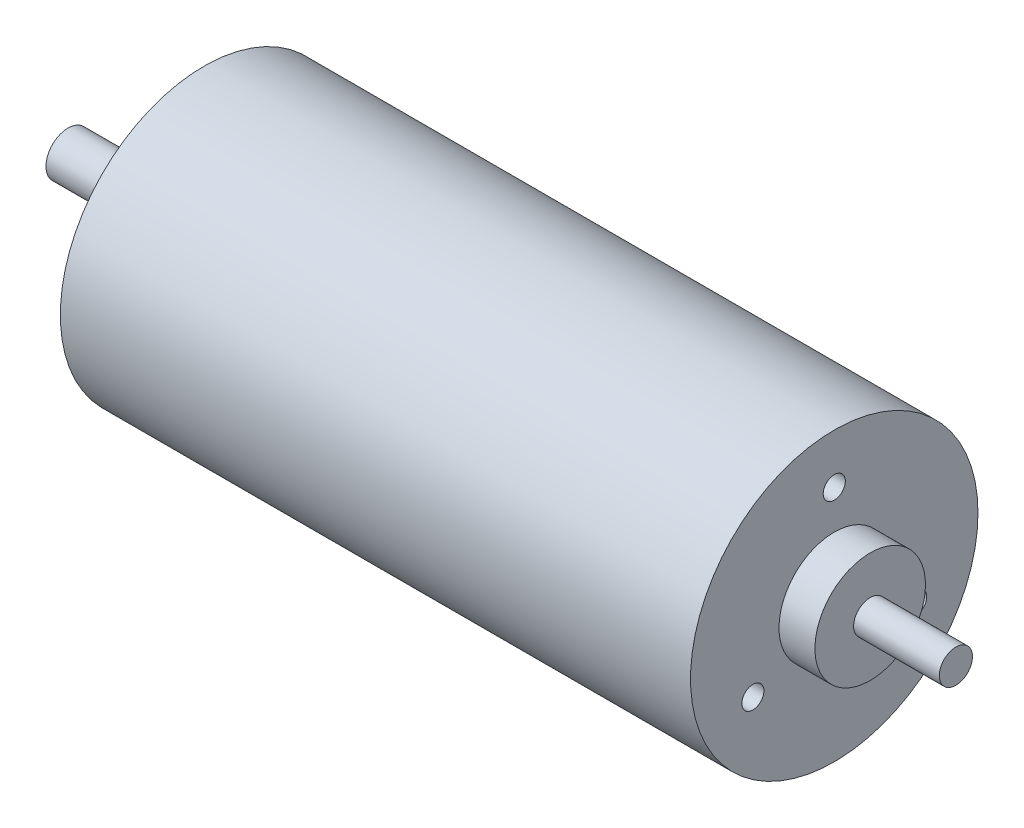
ISO-10303-21;
HEADER;
FILE_DESCRIPTION(('STEP AP214'),'2;1');
FILE_NAME('part.step','',(''),(''),'','','');
FILE_SCHEMA(('AUTOMOTIVE_DESIGN { 1 0 10303 214 1 1 1 1 }'));
ENDSEC;
DATA;
#1=APPLICATION_CONTEXT('core data for automotive mechanical design processes');
#2=APPLICATION_PROTOCOL_DEFINITION('international standard','automotive_design',2000,#1);
#3=PRODUCT_CONTEXT('',#1,'mechanical');
#4=PRODUCT('Part','Part','',(#3));
#5=PRODUCT_RELATED_PRODUCT_CATEGORY('part','',(#4));
#6=PRODUCT_DEFINITION_FORMATION('','',#4);
#7=PRODUCT_DEFINITION_CONTEXT('part definition',#1,'design');
#8=PRODUCT_DEFINITION('design','',#6,#7);
#9=PRODUCT_DEFINITION_SHAPE('','',#8);
#10=(LENGTH_UNIT() NAMED_UNIT(*) SI_UNIT(.MILLI.,.METRE.));
#11=(NAMED_UNIT(*) PLANE_ANGLE_UNIT() SI_UNIT($,.RADIAN.));
#12=(NAMED_UNIT(*) SI_UNIT($,.STERADIAN.) SOLID_ANGLE_UNIT());
#13=UNCERTAINTY_MEASURE_WITH_UNIT(LENGTH_MEASURE(1.E-05),#10,'distance_accuracy_value','');
#14=(GEOMETRIC_REPRESENTATION_CONTEXT(3) GLOBAL_UNCERTAINTY_ASSIGNED_CONTEXT((#13)) GLOBAL_UNIT_ASSIGNED_CONTEXT((#10,
#11,#12)) REPRESENTATION_CONTEXT('',''));
#15=CARTESIAN_POINT('',(0.,0.,0.));
#16=DIRECTION('',(0.,0.,1.));
#17=DIRECTION('',(1.,0.,0.));
#18=AXIS2_PLACEMENT_3D('',#15,#16,#17);
#19=CARTESIAN_POINT('',(0.,0.,0.));
#20=DIRECTION('',(-1.,0.,0.));
#21=DIRECTION('',(0.,0.,1.));
#22=AXIS2_PLACEMENT_3D('',#19,#20,#21);
#23=PLANE('',#22);
#24=CARTESIAN_POINT('',(0.,0.,0.));
#25=DIRECTION('',(1.,0.,0.));
#26=DIRECTION('',(0.,0.,-1.));
#27=AXIS2_PLACEMENT_3D('',#24,#25,#26);
#28=CIRCLE('',#27,2.);
#29=CARTESIAN_POINT('',(0.,0.,-2.));
#30=VERTEX_POINT('',#29);
#31=EDGE_CURVE('E10',#30,#30,#28,.T.);
#32=ORIENTED_EDGE('',*,*,#31,.F.);
#33=EDGE_LOOP('',(#32));
#34=FACE_BOUND('',#33,.T.);
#35=ADVANCED_FACE('F30',(#34),#23,.T.);
#36=CARTESIAN_POINT('',(0.,0.,0.));
#37=DIRECTION('',(1.,0.,0.));
#38=DIRECTION('',(0.,0.,-1.));
#39=AXIS2_PLACEMENT_3D('',#36,#37,#38);
#40=CYLINDRICAL_SURFACE('',#39,2.);
#41=ORIENTED_EDGE('',*,*,#31,.T.);
#42=EDGE_LOOP('',(#41));
#43=FACE_BOUND('',#42,.T.);
#44=CARTESIAN_POINT('',(11.2,0.,0.));
#45=DIRECTION('',(1.,0.,0.));
#46=DIRECTION('',(0.,0.,-1.));
#47=AXIS2_PLACEMENT_3D('',#44,#45,#46);
#48=CIRCLE('',#47,2.);
#49=CARTESIAN_POINT('',(11.2,0.,-2.));
#50=VERTEX_POINT('',#49);
#51=EDGE_CURVE('E36',#50,#50,#48,.T.);
#52=ORIENTED_EDGE('',*,*,#51,.F.);
#53=EDGE_LOOP('',(#52));
#54=FACE_BOUND('',#53,.T.);
#55=ADVANCED_FACE('F137',(#43,#54),#40,.T.);
#56=CARTESIAN_POINT('',(11.2,2.,0.));
#57=DIRECTION('',(-1.,0.,0.));
#58=DIRECTION('',(0.,0.,1.));
#59=AXIS2_PLACEMENT_3D('',#56,#57,#58);
#60=PLANE('',#59);
#61=ORIENTED_EDGE('',*,*,#51,.T.);
#62=EDGE_LOOP('',(#61));
#63=FACE_BOUND('',#62,.T.);
#64=CARTESIAN_POINT('',(11.2,0.,0.));
#65=DIRECTION('',(1.,0.,0.));
#66=DIRECTION('',(0.,0.,-1.));
#67=AXIS2_PLACEMENT_3D('',#64,#65,#66);
#68=CIRCLE('',#67,5.);
#69=CARTESIAN_POINT('',(11.2,0.,-5.));
#70=VERTEX_POINT('',#69);
#71=EDGE_CURVE('E40',#70,#70,#68,.T.);
#72=ORIENTED_EDGE('',*,*,#71,.F.);
#73=EDGE_LOOP('',(#72));
#74=FACE_BOUND('',#73,.T.);
#75=ADVANCED_FACE('F142',(#63,#74),#60,.T.);
#76=CARTESIAN_POINT('',(0.,0.,0.));
#77=DIRECTION('',(1.,0.,0.));
#78=DIRECTION('',(0.,0.,-1.));
#79=AXIS2_PLACEMENT_3D('',#76,#77,#78);
#80=CYLINDRICAL_SURFACE('',#79,5.);
#81=ORIENTED_EDGE('',*,*,#71,.T.);
#82=EDGE_LOOP('',(#81));
#83=FACE_BOUND('',#82,.T.);
#84=CARTESIAN_POINT('',(12.3,0.,0.));
#85=DIRECTION('',(1.,0.,0.));
#86=DIRECTION('',(0.,0.,-1.));
#87=AXIS2_PLACEMENT_3D('',#84,#85,#86);
#88=CIRCLE('',#87,5.);
#89=CARTESIAN_POINT('',(12.3,0.,-5.));
#90=VERTEX_POINT('',#89);
#91=EDGE_CURVE('E44',#90,#90,#88,.T.);
#92=ORIENTED_EDGE('',*,*,#91,.F.);
#93=EDGE_LOOP('',(#92));
#94=FACE_BOUND('',#93,.T.);
#95=ADVANCED_FACE('F146',(#83,#94),#80,.T.);
#96=CARTESIAN_POINT('',(12.3,5.,0.));
#97=DIRECTION('',(-1.,0.,0.));
#98=DIRECTION('',(0.,0.,1.));
#99=AXIS2_PLACEMENT_3D('',#96,#97,#98);
#100=PLANE('',#99);
#101=ORIENTED_EDGE('',*,*,#91,.T.);
#102=EDGE_LOOP('',(#101));
#103=FACE_BOUND('',#102,.T.);
#104=CARTESIAN_POINT('',(12.3,0.,0.));
#105=DIRECTION('',(1.,0.,0.));
#106=DIRECTION('',(0.,0.,-1.));
#107=AXIS2_PLACEMENT_3D('',#104,#105,#106);
#108=CIRCLE('',#107,13.);
#109=CARTESIAN_POINT('',(12.3,0.,-13.));
#110=VERTEX_POINT('',#109);
#111=EDGE_CURVE('E49',#110,#110,#108,.T.);
#112=ORIENTED_EDGE('',*,*,#111,.F.);
#113=EDGE_LOOP('',(#112));
#114=FACE_BOUND('',#113,.T.);
#115=ADVANCED_FACE('F152',(#103,#114),#100,.T.);
#116=CARTESIAN_POINT('',(0.,0.,0.));
#117=DIRECTION('',(1.,0.,0.));
#118=DIRECTION('',(0.,0.,-1.));
#119=AXIS2_PLACEMENT_3D('',#116,#117,#118);
#120=CYLINDRICAL_SURFACE('',#119,13.);
#121=ORIENTED_EDGE('',*,*,#111,.T.);
#122=EDGE_LOOP('',(#121));
#123=FACE_BOUND('',#122,.T.);
#124=CARTESIAN_POINT('',(69.3,0.,0.));
#125=DIRECTION('',(1.,0.,0.));
#126=DIRECTION('',(0.,0.,-1.));
#127=AXIS2_PLACEMENT_3D('',#124,#125,#126);
#128=CIRCLE('',#127,13.);
#129=CARTESIAN_POINT('',(69.3,0.,-13.));
#130=VERTEX_POINT('',#129);
#131=EDGE_CURVE('E52',#130,#130,#128,.T.);
#132=ORIENTED_EDGE('',*,*,#131,.F.);
#133=EDGE_LOOP('',(#132));
#134=FACE_BOUND('',#133,.T.);
#135=ADVANCED_FACE('F99',(#123,#134),#120,.T.);
#136=CARTESIAN_POINT('',(69.3,13.,0.));
#137=DIRECTION('',(1.,0.,0.));
#138=DIRECTION('',(0.,0.,-1.));
#139=AXIS2_PLACEMENT_3D('',#136,#137,#138);
#140=PLANE('',#139);
#141=CARTESIAN_POINT('',(69.3,8.5,0.));
#142=DIRECTION('',(1.,0.,0.));
#143=DIRECTION('',(0.,0.,-1.));
#144=AXIS2_PLACEMENT_3D('',#141,#142,#143);
#145=CIRCLE('',#144,1.);
#146=CARTESIAN_POINT('',(69.3,8.5,-1.));
#147=VERTEX_POINT('',#146);
#148=EDGE_CURVE('E80',#147,#147,#145,.T.);
#149=ORIENTED_EDGE('',*,*,#148,.F.);
#150=EDGE_LOOP('',(#149));
#151=FACE_BOUND('',#150,.T.);
#152=CARTESIAN_POINT('',(69.3,-4.24999999999969,-7.36121593216827));
#153=DIRECTION('',(1.,0.,0.));
#154=DIRECTION('',(0.,0.,-1.));
#155=AXIS2_PLACEMENT_3D('',#152,#153,#154);
#156=CIRCLE('',#155,1.00000000000047);
#157=CARTESIAN_POINT('',(69.3,-4.24999999999969,-8.36121593216874));
#158=VERTEX_POINT('',#157);
#159=EDGE_CURVE('E74',#158,#158,#156,.T.);
#160=ORIENTED_EDGE('',*,*,#159,.F.);
#161=EDGE_LOOP('',(#160));
#162=FACE_BOUND('',#161,.T.);
#163=CARTESIAN_POINT('',(69.3,-4.25000000000032,7.36121593216719));
#164=DIRECTION('',(1.,0.,0.));
#165=DIRECTION('',(0.,0.,-1.));
#166=AXIS2_PLACEMENT_3D('',#163,#164,#165);
#167=CIRCLE('',#166,1.00000000000069);
#168=CARTESIAN_POINT('',(69.3,-4.25000000000032,6.3612159321665));
#169=VERTEX_POINT('',#168);
#170=EDGE_CURVE('E68',#169,#169,#167,.T.);
#171=ORIENTED_EDGE('',*,*,#170,.F.);
#172=EDGE_LOOP('',(#171));
#173=FACE_BOUND('',#172,.T.);
#174=ORIENTED_EDGE('',*,*,#131,.T.);
#175=EDGE_LOOP('',(#174));
#176=FACE_BOUND('',#175,.T.);
#177=CARTESIAN_POINT('',(69.3,0.,0.));
#178=DIRECTION('',(1.,0.,0.));
#179=DIRECTION('',(0.,0.,-1.));
#180=AXIS2_PLACEMENT_3D('',#177,#178,#179);
#181=CIRCLE('',#180,5.00000000000001);
#182=CARTESIAN_POINT('',(69.3,0.,-5.00000000000001));
#183=VERTEX_POINT('',#182);
#184=EDGE_CURVE('E55',#183,#183,#181,.T.);
#185=ORIENTED_EDGE('',*,*,#184,.F.);
#186=EDGE_LOOP('',(#185));
#187=FACE_BOUND('',#186,.T.);
#188=ADVANCED_FACE('F95',(#151,#162,#173,#176,#187),#140,.T.);
#189=CARTESIAN_POINT('',(0.,0.,0.));
#190=DIRECTION('',(1.,0.,0.));
#191=DIRECTION('',(0.,0.,-1.));
#192=AXIS2_PLACEMENT_3D('',#189,#190,#191);
#193=CYLINDRICAL_SURFACE('',#192,5.00000000000001);
#194=ORIENTED_EDGE('',*,*,#184,.T.);
#195=EDGE_LOOP('',(#194));
#196=FACE_BOUND('',#195,.T.);
#197=CARTESIAN_POINT('',(72.55,0.,0.));
#198=DIRECTION('',(1.,0.,0.));
#199=DIRECTION('',(0.,0.,-1.));
#200=AXIS2_PLACEMENT_3D('',#197,#198,#199);
#201=CIRCLE('',#200,5.00000000000001);
#202=CARTESIAN_POINT('',(72.55,0.,-5.00000000000001));
#203=VERTEX_POINT('',#202);
#204=EDGE_CURVE('E58',#203,#203,#201,.T.);
#205=ORIENTED_EDGE('',*,*,#204,.F.);
#206=EDGE_LOOP('',(#205));
#207=FACE_BOUND('',#206,.T.);
#208=ADVANCED_FACE('F98',(#196,#207),#193,.T.);
#209=CARTESIAN_POINT('',(72.55,5.00000000000001,0.));
#210=DIRECTION('',(1.,0.,0.));
#211=DIRECTION('',(0.,0.,-1.));
#212=AXIS2_PLACEMENT_3D('',#209,#210,#211);
#213=PLANE('',#212);
#214=ORIENTED_EDGE('',*,*,#204,.T.);
#215=EDGE_LOOP('',(#214));
#216=FACE_BOUND('',#215,.T.);
#217=CARTESIAN_POINT('',(72.55,0.,0.));
#218=DIRECTION('',(1.,0.,0.));
#219=DIRECTION('',(0.,0.,-1.));
#220=AXIS2_PLACEMENT_3D('',#217,#218,#219);
#221=CIRCLE('',#220,1.50000000000001);
#222=CARTESIAN_POINT('',(72.55,0.,-1.50000000000001));
#223=VERTEX_POINT('',#222);
#224=EDGE_CURVE('E61',#223,#223,#221,.T.);
#225=ORIENTED_EDGE('',*,*,#224,.F.);
#226=EDGE_LOOP('',(#225));
#227=FACE_BOUND('',#226,.T.);
#228=ADVANCED_FACE('F111',(#216,#227),#213,.T.);
#229=CARTESIAN_POINT('',(0.,0.,0.));
#230=DIRECTION('',(1.,0.,0.));
#231=DIRECTION('',(0.,0.,-1.));
#232=AXIS2_PLACEMENT_3D('',#229,#230,#231);
#233=CYLINDRICAL_SURFACE('',#232,1.50000000000001);
#234=ORIENTED_EDGE('',*,*,#224,.T.);
#235=EDGE_LOOP('',(#234));
#236=FACE_BOUND('',#235,.T.);
#237=CARTESIAN_POINT('',(80.3,0.,0.));
#238=DIRECTION('',(1.,0.,0.));
#239=DIRECTION('',(0.,0.,-1.));
#240=AXIS2_PLACEMENT_3D('',#237,#238,#239);
#241=CIRCLE('',#240,1.50000000000001);
#242=CARTESIAN_POINT('',(80.3,0.,-1.50000000000001));
#243=VERTEX_POINT('',#242);
#244=EDGE_CURVE('E64',#243,#243,#241,.T.);
#245=ORIENTED_EDGE('',*,*,#244,.F.);
#246=EDGE_LOOP('',(#245));
#247=FACE_BOUND('',#246,.T.);
#248=ADVANCED_FACE('F117',(#236,#247),#233,.T.);
#249=CARTESIAN_POINT('',(80.3,1.50000000000001,0.));
#250=DIRECTION('',(1.,0.,0.));
#251=DIRECTION('',(0.,0.,-1.));
#252=AXIS2_PLACEMENT_3D('',#249,#250,#251);
#253=PLANE('',#252);
#254=ORIENTED_EDGE('',*,*,#244,.T.);
#255=EDGE_LOOP('',(#254));
#256=FACE_BOUND('',#255,.T.);
#257=ADVANCED_FACE('F123',(#256),#253,.T.);
#258=CARTESIAN_POINT('',(66.4,-4.25000000000032,7.36121593216719));
#259=DIRECTION('',(1.,0.,0.));
#260=DIRECTION('',(0.,0.,-1.));
#261=AXIS2_PLACEMENT_3D('',#258,#259,#260);
#262=CYLINDRICAL_SURFACE('',#261,1.00000000000069);
#263=CARTESIAN_POINT('',(66.4,-4.25000000000032,7.36121593216719));
#264=DIRECTION('',(1.,0.,0.));
#265=DIRECTION('',(0.,0.,-1.));
#266=AXIS2_PLACEMENT_3D('',#263,#264,#265);
#267=CIRCLE('',#266,1.00000000000069);
#268=CARTESIAN_POINT('',(66.4,-4.25000000000032,6.3612159321665));
#269=VERTEX_POINT('',#268);
#270=EDGE_CURVE('E71',#269,#269,#267,.T.);
#271=ORIENTED_EDGE('',*,*,#270,.F.);
#272=EDGE_LOOP('',(#271));
#273=FACE_BOUND('',#272,.T.);
#274=ORIENTED_EDGE('',*,*,#170,.T.);
#275=EDGE_LOOP('',(#274));
#276=FACE_BOUND('',#275,.T.);
#277=ADVANCED_FACE('F128',(#273,#276),#262,.F.);
#278=CARTESIAN_POINT('',(66.4,-4.25000000000032,7.36121593216719));
#279=DIRECTION('',(1.,0.,0.));
#280=DIRECTION('',(0.,0.,-1.));
#281=AXIS2_PLACEMENT_3D('',#278,#279,#280);
#282=PLANE('',#281);
#283=ORIENTED_EDGE('',*,*,#270,.T.);
#284=EDGE_LOOP('',(#283));
#285=FACE_BOUND('',#284,.T.);
#286=ADVANCED_FACE('F133',(#285),#282,.T.);
#287=CARTESIAN_POINT('',(66.4,-4.24999999999969,-7.36121593216827));
#288=DIRECTION('',(1.,0.,0.));
#289=DIRECTION('',(0.,0.,-1.));
#290=AXIS2_PLACEMENT_3D('',#287,#288,#289);
#291=CYLINDRICAL_SURFACE('',#290,1.00000000000047);
#292=CARTESIAN_POINT('',(66.4,-4.24999999999969,-7.36121593216827));
#293=DIRECTION('',(1.,0.,0.));
#294=DIRECTION('',(0.,0.,-1.));
#295=AXIS2_PLACEMENT_3D('',#292,#293,#294);
#296=CIRCLE('',#295,1.00000000000047);
#297=CARTESIAN_POINT('',(66.4,-4.24999999999969,-8.36121593216874));
#298=VERTEX_POINT('',#297);
#299=EDGE_CURVE('E77',#298,#298,#296,.T.);
#300=ORIENTED_EDGE('',*,*,#299,.F.);
#301=EDGE_LOOP('',(#300));
#302=FACE_BOUND('',#301,.T.);
#303=ORIENTED_EDGE('',*,*,#159,.T.);
#304=EDGE_LOOP('',(#303));
#305=FACE_BOUND('',#304,.T.);
#306=ADVANCED_FACE('F201',(#302,#305),#291,.F.);
#307=CARTESIAN_POINT('',(66.4,-4.24999999999969,-7.36121593216827));
#308=DIRECTION('',(1.,0.,0.));
#309=DIRECTION('',(0.,0.,-1.));
#310=AXIS2_PLACEMENT_3D('',#307,#308,#309);
#311=PLANE('',#310);
#312=ORIENTED_EDGE('',*,*,#299,.T.);
#313=EDGE_LOOP('',(#312));
#314=FACE_BOUND('',#313,.T.);
#315=ADVANCED_FACE('F91',(#314),#311,.T.);
#316=CARTESIAN_POINT('',(66.4,8.5,0.));
#317=DIRECTION('',(1.,0.,0.));
#318=DIRECTION('',(0.,0.,-1.));
#319=AXIS2_PLACEMENT_3D('',#316,#317,#318);
#320=CYLINDRICAL_SURFACE('',#319,1.);
#321=CARTESIAN_POINT('',(66.4,8.5,0.));
#322=DIRECTION('',(1.,0.,0.));
#323=DIRECTION('',(0.,0.,-1.));
#324=AXIS2_PLACEMENT_3D('',#321,#322,#323);
#325=CIRCLE('',#324,1.);
#326=CARTESIAN_POINT('',(66.4,8.5,-1.));
#327=VERTEX_POINT('',#326);
#328=EDGE_CURVE('E67',#327,#327,#325,.T.);
#329=ORIENTED_EDGE('',*,*,#328,.F.);
#330=EDGE_LOOP('',(#329));
#331=FACE_BOUND('',#330,.T.);
#332=ORIENTED_EDGE('',*,*,#148,.T.);
#333=EDGE_LOOP('',(#332));
#334=FACE_BOUND('',#333,.T.);
#335=ADVANCED_FACE('F88',(#331,#334),#320,.F.);
#336=CARTESIAN_POINT('',(66.4,8.5,0.));
#337=DIRECTION('',(1.,0.,0.));
#338=DIRECTION('',(0.,0.,-1.));
#339=AXIS2_PLACEMENT_3D('',#336,#337,#338);
#340=PLANE('',#339);
#341=ORIENTED_EDGE('',*,*,#328,.T.);
#342=EDGE_LOOP('',(#341));
#343=FACE_BOUND('',#342,.T.);
#344=ADVANCED_FACE('F86',(#343),#340,.T.);
#345=CLOSED_SHELL('',(#35,#55,#75,#95,#115,#135,#188,#208,#228,#248,#257,#277,#286,#306,#315,
#335,#344));
#346=MANIFOLD_SOLID_BREP('B2',#345);
#347=ADVANCED_BREP_SHAPE_REPRESENTATION('',(#18,#346),#14);
#348=SHAPE_DEFINITION_REPRESENTATION(#9,#347);
ENDSEC;
END-ISO-10303-21;
